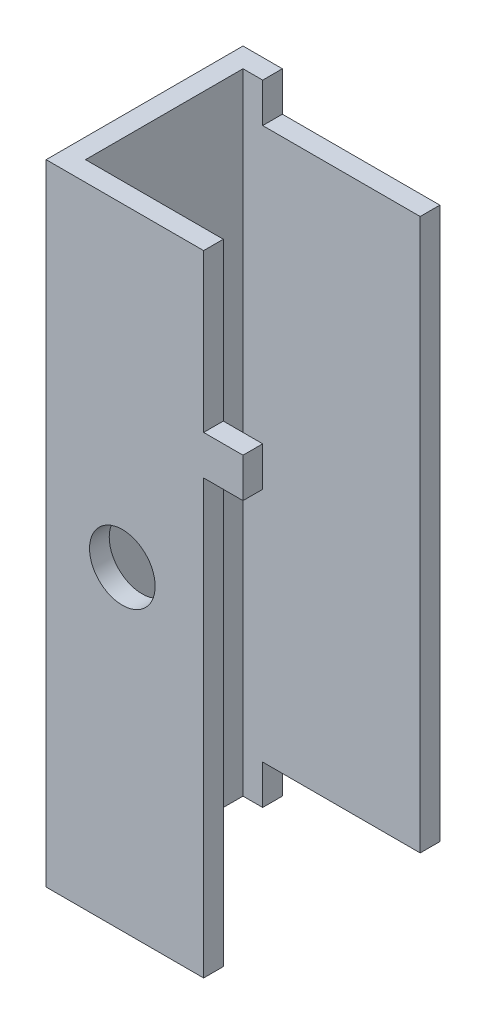
ISO-10303-21;
HEADER;
FILE_DESCRIPTION(('STEP AP214'),'2;1');
FILE_NAME('part.step','',(''),(''),'','','');
FILE_SCHEMA(('AUTOMOTIVE_DESIGN { 1 0 10303 214 1 1 1 1 }'));
ENDSEC;
DATA;
#1=APPLICATION_CONTEXT('core data for automotive mechanical design processes');
#2=APPLICATION_PROTOCOL_DEFINITION('international standard','automotive_design',2000,#1);
#3=PRODUCT_CONTEXT('',#1,'mechanical');
#4=PRODUCT('Part','Part','',(#3));
#5=PRODUCT_RELATED_PRODUCT_CATEGORY('part','',(#4));
#6=PRODUCT_DEFINITION_FORMATION('','',#4);
#7=PRODUCT_DEFINITION_CONTEXT('part definition',#1,'design');
#8=PRODUCT_DEFINITION('design','',#6,#7);
#9=PRODUCT_DEFINITION_SHAPE('','',#8);
#10=(LENGTH_UNIT() NAMED_UNIT(*) SI_UNIT(.MILLI.,.METRE.));
#11=(NAMED_UNIT(*) PLANE_ANGLE_UNIT() SI_UNIT($,.RADIAN.));
#12=(NAMED_UNIT(*) SI_UNIT($,.STERADIAN.) SOLID_ANGLE_UNIT());
#13=UNCERTAINTY_MEASURE_WITH_UNIT(LENGTH_MEASURE(1.E-05),#10,'distance_accuracy_value','');
#14=(GEOMETRIC_REPRESENTATION_CONTEXT(3) GLOBAL_UNCERTAINTY_ASSIGNED_CONTEXT((#13)) GLOBAL_UNIT_ASSIGNED_CONTEXT((#10,
#11,#12)) REPRESENTATION_CONTEXT('',''));
#15=CARTESIAN_POINT('',(0.,0.,0.));
#16=DIRECTION('',(0.,0.,1.));
#17=DIRECTION('',(1.,0.,0.));
#18=AXIS2_PLACEMENT_3D('',#15,#16,#17);
#19=CARTESIAN_POINT('',(-1.6,0.8,0.));
#20=DIRECTION('',(-1.,0.,0.));
#21=DIRECTION('',(0.,0.,1.));
#22=AXIS2_PLACEMENT_3D('',#19,#20,#21);
#23=PLANE('',#22);
#24=DIRECTION('',(0.,-1.,0.));
#25=VECTOR('',#24,1.);
#26=CARTESIAN_POINT('',(-1.60000000001,0.80000000001,0.));
#27=LINE('',#26,#25);
#28=CARTESIAN_POINT('',(-1.6,0.8,0.));
#29=VERTEX_POINT('',#28);
#30=CARTESIAN_POINT('',(-1.6,-0.8,0.));
#31=VERTEX_POINT('',#30);
#32=EDGE_CURVE('E271',#29,#31,#27,.T.);
#33=ORIENTED_EDGE('',*,*,#32,.T.);
#34=DIRECTION('',(0.,0.,1.));
#35=VECTOR('',#34,1.);
#36=CARTESIAN_POINT('',(-1.60000000001,-0.80000000001,0.));
#37=LINE('',#36,#35);
#38=CARTESIAN_POINT('',(-1.6,-0.8,0.5));
#39=VERTEX_POINT('',#38);
#40=EDGE_CURVE('E26',#31,#39,#37,.T.);
#41=ORIENTED_EDGE('',*,*,#40,.T.);
#42=DIRECTION('',(0.,-1.,0.));
#43=VECTOR('',#42,1.);
#44=CARTESIAN_POINT('',(-1.60000000001,0.80000000001,0.50000000001));
#45=LINE('',#44,#43);
#46=CARTESIAN_POINT('',(-1.6,0.8,0.5));
#47=VERTEX_POINT('',#46);
#48=EDGE_CURVE('E286',#47,#39,#45,.T.);
#49=ORIENTED_EDGE('',*,*,#48,.F.);
#50=DIRECTION('',(0.,0.,1.));
#51=VECTOR('',#50,1.);
#52=CARTESIAN_POINT('',(-1.60000000001,0.80000000001,0.));
#53=LINE('',#52,#51);
#54=EDGE_CURVE('E11',#29,#47,#53,.T.);
#55=ORIENTED_EDGE('',*,*,#54,.F.);
#56=EDGE_LOOP('',(#33,#41,#49,#55));
#57=FACE_BOUND('',#56,.T.);
#58=ADVANCED_FACE('F17',(#57),#23,.T.);
#59=CARTESIAN_POINT('',(1.6,0.8,0.));
#60=DIRECTION('',(0.,1.,0.));
#61=DIRECTION('',(1.,0.,0.));
#62=AXIS2_PLACEMENT_3D('',#59,#60,#61);
#63=PLANE('',#62);
#64=DIRECTION('',(0.,0.,-1.));
#65=VECTOR('',#64,1.);
#66=CARTESIAN_POINT('',(-1.50000000001,0.80000000001,0.));
#67=LINE('',#66,#65);
#68=CARTESIAN_POINT('',(-1.5,0.8,0.05));
#69=VERTEX_POINT('',#68);
#70=CARTESIAN_POINT('',(-1.5,0.8,0.));
#71=VERTEX_POINT('',#70);
#72=EDGE_CURVE('E213',#69,#71,#67,.T.);
#73=ORIENTED_EDGE('',*,*,#72,.T.);
#74=DIRECTION('',(-1.,0.,0.));
#75=VECTOR('',#74,1.);
#76=CARTESIAN_POINT('',(1.60000000001,0.80000000001,0.));
#77=LINE('',#76,#75);
#78=EDGE_CURVE('E273',#71,#29,#77,.T.);
#79=ORIENTED_EDGE('',*,*,#78,.T.);
#80=ORIENTED_EDGE('',*,*,#54,.T.);
#81=DIRECTION('',(-1.,0.,0.));
#82=VECTOR('',#81,1.);
#83=CARTESIAN_POINT('',(1.60000000001,0.80000000001,0.50000000001));
#84=LINE('',#83,#82);
#85=CARTESIAN_POINT('',(-1.2,0.8,0.5));
#86=VERTEX_POINT('',#85);
#87=EDGE_CURVE('E291',#86,#47,#84,.T.);
#88=ORIENTED_EDGE('',*,*,#87,.F.);
#89=DIRECTION('',(0.,0.,-1.));
#90=VECTOR('',#89,1.);
#91=CARTESIAN_POINT('',(-1.20000000001,0.80000000001,0.25000000001));
#92=LINE('',#91,#90);
#93=CARTESIAN_POINT('',(-1.2,0.8,0.45));
#94=VERTEX_POINT('',#93);
#95=EDGE_CURVE('E258',#86,#94,#92,.T.);
#96=ORIENTED_EDGE('',*,*,#95,.T.);
#97=DIRECTION('',(-1.,0.,0.));
#98=VECTOR('',#97,1.);
#99=CARTESIAN_POINT('',(1.57500000001,0.80000000001,0.45000000001));
#100=LINE('',#99,#98);
#101=CARTESIAN_POINT('',(-1.55,0.8,0.45));
#102=VERTEX_POINT('',#101);
#103=EDGE_CURVE('E262',#94,#102,#100,.T.);
#104=ORIENTED_EDGE('',*,*,#103,.T.);
#105=DIRECTION('',(0.,0.,-1.));
#106=VECTOR('',#105,1.);
#107=CARTESIAN_POINT('',(-1.55000000001,0.80000000001,0.22500000001));
#108=LINE('',#107,#106);
#109=CARTESIAN_POINT('',(-1.55,0.8,0.05));
#110=VERTEX_POINT('',#109);
#111=EDGE_CURVE('E363',#102,#110,#108,.T.);
#112=ORIENTED_EDGE('',*,*,#111,.T.);
#113=DIRECTION('',(1.,0.,0.));
#114=VECTOR('',#113,1.);
#115=CARTESIAN_POINT('',(0.02500000001,0.80000000001,0.05000000001));
#116=LINE('',#115,#114);
#117=EDGE_CURVE('E304',#110,#69,#116,.T.);
#118=ORIENTED_EDGE('',*,*,#117,.T.);
#119=EDGE_LOOP('',(#73,#79,#80,#88,#96,#104,#112,#118));
#120=FACE_BOUND('',#119,.T.);
#121=ADVANCED_FACE('F396',(#120),#63,.T.);
#122=CARTESIAN_POINT('',(-1.2,0.3,0.5));
#123=DIRECTION('',(0.,1.,0.));
#124=DIRECTION('',(1.,0.,0.));
#125=AXIS2_PLACEMENT_3D('',#122,#123,#124);
#126=PLANE('',#125);
#127=DIRECTION('',(-1.,0.,0.));
#128=VECTOR('',#127,1.);
#129=CARTESIAN_POINT('',(0.17500000001,0.30000000001,0.45000000001));
#130=LINE('',#129,#128);
#131=CARTESIAN_POINT('',(-1.1,0.3,0.45));
#132=VERTEX_POINT('',#131);
#133=CARTESIAN_POINT('',(-1.2,0.3,0.45));
#134=VERTEX_POINT('',#133);
#135=EDGE_CURVE('E341',#132,#134,#130,.T.);
#136=ORIENTED_EDGE('',*,*,#135,.F.);
#137=DIRECTION('',(0.,0.,-1.));
#138=VECTOR('',#137,1.);
#139=CARTESIAN_POINT('',(-1.10000000001,0.30000000001,0.50000000001));
#140=LINE('',#139,#138);
#141=CARTESIAN_POINT('',(-1.1,0.3,0.5));
#142=VERTEX_POINT('',#141);
#143=EDGE_CURVE('E376',#142,#132,#140,.T.);
#144=ORIENTED_EDGE('',*,*,#143,.F.);
#145=DIRECTION('',(1.,0.,0.));
#146=VECTOR('',#145,1.);
#147=CARTESIAN_POINT('',(-0.60000000001,0.30000000001,0.50000000001));
#148=LINE('',#147,#146);
#149=CARTESIAN_POINT('',(-1.2,0.3,0.5));
#150=VERTEX_POINT('',#149);
#151=EDGE_CURVE('E359',#150,#142,#148,.T.);
#152=ORIENTED_EDGE('',*,*,#151,.F.);
#153=DIRECTION('',(0.,0.,-1.));
#154=VECTOR('',#153,1.);
#155=CARTESIAN_POINT('',(-1.20000000001,0.30000000001,0.50000000001));
#156=LINE('',#155,#154);
#157=EDGE_CURVE('E241',#150,#134,#156,.T.);
#158=ORIENTED_EDGE('',*,*,#157,.T.);
#159=EDGE_LOOP('',(#136,#144,#152,#158));
#160=FACE_BOUND('',#159,.T.);
#161=ADVANCED_FACE('F422',(#160),#126,.F.);
#162=CARTESIAN_POINT('',(-1.1,-0.7,0.));
#163=DIRECTION('',(0.,1.,0.));
#164=DIRECTION('',(1.,0.,0.));
#165=AXIS2_PLACEMENT_3D('',#162,#163,#164);
#166=PLANE('',#165);
#167=DIRECTION('',(1.,0.,0.));
#168=VECTOR('',#167,1.);
#169=CARTESIAN_POINT('',(-1.32500000001,-0.70000000001,0.05000000001));
#170=LINE('',#169,#168);
#171=CARTESIAN_POINT('',(-1.5,-0.7,0.05));
#172=VERTEX_POINT('',#171);
#173=CARTESIAN_POINT('',(-1.1,-0.7,0.05));
#174=VERTEX_POINT('',#173);
#175=EDGE_CURVE('E315',#172,#174,#170,.T.);
#176=ORIENTED_EDGE('',*,*,#175,.F.);
#177=DIRECTION('',(0.,0.,1.));
#178=VECTOR('',#177,1.);
#179=CARTESIAN_POINT('',(-1.50000000001,-0.70000000001,0.));
#180=LINE('',#179,#178);
#181=CARTESIAN_POINT('',(-1.5,-0.7,0.));
#182=VERTEX_POINT('',#181);
#183=EDGE_CURVE('E197',#182,#172,#180,.T.);
#184=ORIENTED_EDGE('',*,*,#183,.F.);
#185=DIRECTION('',(-1.,0.,0.));
#186=VECTOR('',#185,1.);
#187=CARTESIAN_POINT('',(-0.55000000001,-0.70000000001,0.));
#188=LINE('',#187,#186);
#189=CARTESIAN_POINT('',(-1.1,-0.7,0.));
#190=VERTEX_POINT('',#189);
#191=EDGE_CURVE('E249',#190,#182,#188,.T.);
#192=ORIENTED_EDGE('',*,*,#191,.F.);
#193=DIRECTION('',(0.,0.,-1.));
#194=VECTOR('',#193,1.);
#195=CARTESIAN_POINT('',(-1.10000000001,-0.70000000001,0.25000000001));
#196=LINE('',#195,#194);
#197=EDGE_CURVE('E20',#174,#190,#196,.T.);
#198=ORIENTED_EDGE('',*,*,#197,.F.);
#199=EDGE_LOOP('',(#176,#184,#192,#198));
#200=FACE_BOUND('',#199,.T.);
#201=ADVANCED_FACE('F390',(#200),#166,.F.);
#202=CARTESIAN_POINT('',(-1.6,-0.8,0.));
#203=DIRECTION('',(0.,-1.,0.));
#204=DIRECTION('',(0.,0.,-1.));
#205=AXIS2_PLACEMENT_3D('',#202,#203,#204);
#206=PLANE('',#205);
#207=DIRECTION('',(0.,0.,1.));
#208=VECTOR('',#207,1.);
#209=CARTESIAN_POINT('',(-1.50000000001,-0.80000000001,0.));
#210=LINE('',#209,#208);
#211=CARTESIAN_POINT('',(-1.5,-0.8,0.));
#212=VERTEX_POINT('',#211);
#213=CARTESIAN_POINT('',(-1.5,-0.8,0.05));
#214=VERTEX_POINT('',#213);
#215=EDGE_CURVE('E245',#212,#214,#210,.T.);
#216=ORIENTED_EDGE('',*,*,#215,.T.);
#217=DIRECTION('',(-1.,0.,0.));
#218=VECTOR('',#217,1.);
#219=CARTESIAN_POINT('',(-1.57500000001,-0.80000000001,0.05000000001));
#220=LINE('',#219,#218);
#221=CARTESIAN_POINT('',(-1.55,-0.8,0.05));
#222=VERTEX_POINT('',#221);
#223=EDGE_CURVE('E311',#214,#222,#220,.T.);
#224=ORIENTED_EDGE('',*,*,#223,.T.);
#225=DIRECTION('',(0.,0.,1.));
#226=VECTOR('',#225,1.);
#227=CARTESIAN_POINT('',(-1.55000000001,-0.80000000001,0.22500000001));
#228=LINE('',#227,#226);
#229=CARTESIAN_POINT('',(-1.55,-0.8,0.45));
#230=VERTEX_POINT('',#229);
#231=EDGE_CURVE('E360',#222,#230,#228,.T.);
#232=ORIENTED_EDGE('',*,*,#231,.T.);
#233=DIRECTION('',(1.,0.,0.));
#234=VECTOR('',#233,1.);
#235=CARTESIAN_POINT('',(-0.02500000001,-0.80000000001,0.45000000001));
#236=LINE('',#235,#234);
#237=CARTESIAN_POINT('',(-1.2,-0.8,0.45));
#238=VERTEX_POINT('',#237);
#239=EDGE_CURVE('E296',#230,#238,#236,.T.);
#240=ORIENTED_EDGE('',*,*,#239,.T.);
#241=DIRECTION('',(0.,0.,1.));
#242=VECTOR('',#241,1.);
#243=CARTESIAN_POINT('',(-1.20000000001,-0.80000000001,0.25000000001));
#244=LINE('',#243,#242);
#245=CARTESIAN_POINT('',(-1.2,-0.8,0.5));
#246=VERTEX_POINT('',#245);
#247=EDGE_CURVE('E240',#238,#246,#244,.T.);
#248=ORIENTED_EDGE('',*,*,#247,.T.);
#249=DIRECTION('',(1.,0.,0.));
#250=VECTOR('',#249,1.);
#251=CARTESIAN_POINT('',(-1.60000000001,-0.80000000001,0.50000000001));
#252=LINE('',#251,#250);
#253=EDGE_CURVE('E290',#39,#246,#252,.T.);
#254=ORIENTED_EDGE('',*,*,#253,.F.);
#255=ORIENTED_EDGE('',*,*,#40,.F.);
#256=DIRECTION('',(1.,0.,0.));
#257=VECTOR('',#256,1.);
#258=CARTESIAN_POINT('',(-1.60000000001,-0.80000000001,0.));
#259=LINE('',#258,#257);
#260=EDGE_CURVE('E252',#31,#212,#259,.T.);
#261=ORIENTED_EDGE('',*,*,#260,.T.);
#262=EDGE_LOOP('',(#216,#224,#232,#240,#248,#254,#255,#261));
#263=FACE_BOUND('',#262,.T.);
#264=ADVANCED_FACE('F403',(#263),#206,.T.);
#265=CARTESIAN_POINT('',(-1.1,-0.8,0.5));
#266=DIRECTION('',(-1.,0.,0.));
#267=DIRECTION('',(0.,0.,1.));
#268=AXIS2_PLACEMENT_3D('',#265,#266,#267);
#269=PLANE('',#268);
#270=DIRECTION('',(0.,0.,1.));
#271=VECTOR('',#270,1.);
#272=CARTESIAN_POINT('',(-1.10000000001,0.70000000001,0.25000000001));
#273=LINE('',#272,#271);
#274=CARTESIAN_POINT('',(-1.1,0.7,0.));
#275=VERTEX_POINT('',#274);
#276=CARTESIAN_POINT('',(-1.1,0.7,0.05));
#277=VERTEX_POINT('',#276);
#278=EDGE_CURVE('E196',#275,#277,#273,.T.);
#279=ORIENTED_EDGE('',*,*,#278,.T.);
#280=DIRECTION('',(0.,-1.,0.));
#281=VECTOR('',#280,1.);
#282=CARTESIAN_POINT('',(-1.10000000001,-0.80000000001,0.05000000001));
#283=LINE('',#282,#281);
#284=EDGE_CURVE('E191',#277,#174,#283,.T.);
#285=ORIENTED_EDGE('',*,*,#284,.T.);
#286=ORIENTED_EDGE('',*,*,#197,.T.);
#287=DIRECTION('',(0.,-1.,0.));
#288=VECTOR('',#287,1.);
#289=CARTESIAN_POINT('',(-1.10000000001,-0.40000000001,0.));
#290=LINE('',#289,#288);
#291=EDGE_CURVE('E253',#275,#190,#290,.T.);
#292=ORIENTED_EDGE('',*,*,#291,.F.);
#293=EDGE_LOOP('',(#279,#285,#286,#292));
#294=FACE_BOUND('',#293,.T.);
#295=ADVANCED_FACE('F387',(#294),#269,.F.);
#296=CARTESIAN_POINT('',(-1.1,-0.8,0.5));
#297=DIRECTION('',(-1.,0.,0.));
#298=DIRECTION('',(0.,0.,1.));
#299=AXIS2_PLACEMENT_3D('',#296,#297,#298);
#300=PLANE('',#299);
#301=ORIENTED_EDGE('',*,*,#143,.T.);
#302=DIRECTION('',(0.,1.,0.));
#303=VECTOR('',#302,1.);
#304=CARTESIAN_POINT('',(-1.10000000001,-0.80000000001,0.45000000001));
#305=LINE('',#304,#303);
#306=CARTESIAN_POINT('',(-1.1,0.4,0.45));
#307=VERTEX_POINT('',#306);
#308=EDGE_CURVE('E338',#132,#307,#305,.T.);
#309=ORIENTED_EDGE('',*,*,#308,.T.);
#310=DIRECTION('',(0.,0.,1.));
#311=VECTOR('',#310,1.);
#312=CARTESIAN_POINT('',(-1.10000000001,0.40000000001,0.50000000001));
#313=LINE('',#312,#311);
#314=CARTESIAN_POINT('',(-1.1,0.4,0.5));
#315=VERTEX_POINT('',#314);
#316=EDGE_CURVE('E328',#307,#315,#313,.T.);
#317=ORIENTED_EDGE('',*,*,#316,.T.);
#318=DIRECTION('',(0.,1.,0.));
#319=VECTOR('',#318,1.);
#320=CARTESIAN_POINT('',(-1.10000000001,-0.40000000001,0.50000000001));
#321=LINE('',#320,#319);
#322=EDGE_CURVE('E367',#142,#315,#321,.T.);
#323=ORIENTED_EDGE('',*,*,#322,.F.);
#324=EDGE_LOOP('',(#301,#309,#317,#323));
#325=FACE_BOUND('',#324,.T.);
#326=ADVANCED_FACE('F440',(#325),#300,.F.);
#327=CARTESIAN_POINT('',(-1.55,-0.8,0.45));
#328=DIRECTION('',(-1.,0.,0.));
#329=DIRECTION('',(0.,0.,1.));
#330=AXIS2_PLACEMENT_3D('',#327,#328,#329);
#331=PLANE('',#330);
#332=ORIENTED_EDGE('',*,*,#231,.F.);
#333=DIRECTION('',(0.,-1.,0.));
#334=VECTOR('',#333,1.);
#335=CARTESIAN_POINT('',(-1.55000000001,-0.80000000001,0.05000000001));
#336=LINE('',#335,#334);
#337=EDGE_CURVE('E307',#110,#222,#336,.T.);
#338=ORIENTED_EDGE('',*,*,#337,.F.);
#339=ORIENTED_EDGE('',*,*,#111,.F.);
#340=DIRECTION('',(0.,-1.,0.));
#341=VECTOR('',#340,1.);
#342=CARTESIAN_POINT('',(-1.55000000001,-0.80000000001,0.45000000001));
#343=LINE('',#342,#341);
#344=EDGE_CURVE('E292',#102,#230,#343,.T.);
#345=ORIENTED_EDGE('',*,*,#344,.T.);
#346=EDGE_LOOP('',(#332,#338,#339,#345));
#347=FACE_BOUND('',#346,.T.);
#348=ADVANCED_FACE('F399',(#347),#331,.F.);
#349=CARTESIAN_POINT('',(0.,0.,0.5));
#350=DIRECTION('',(0.,0.,1.));
#351=DIRECTION('',(1.,0.,0.));
#352=AXIS2_PLACEMENT_3D('',#349,#350,#351);
#353=PLANE('',#352);
#354=CARTESIAN_POINT('',(-1.406451372786,0.,0.50000000001));
#355=DIRECTION('',(0.,0.,-1.));
#356=DIRECTION('',(-1.,0.,0.));
#357=AXIS2_PLACEMENT_3D('',#354,#355,#356);
#358=CIRCLE('',#357,0.0833178);
#359=CARTESIAN_POINT('',(-1.489769172786,0.,0.50000000001));
#360=VERTEX_POINT('',#359);
#361=CARTESIAN_POINT('',(-1.323133572776,0.,0.50000000001));
#362=VERTEX_POINT('',#361);
#363=EDGE_CURVE('E219',#360,#362,#358,.T.);
#364=ORIENTED_EDGE('',*,*,#363,.T.);
#365=CARTESIAN_POINT('',(-1.406451372786,0.,0.50000000001));
#366=DIRECTION('',(0.,0.,-1.));
#367=DIRECTION('',(-1.,0.,0.));
#368=AXIS2_PLACEMENT_3D('',#365,#366,#367);
#369=CIRCLE('',#368,0.0833178);
#370=EDGE_CURVE('E222',#362,#360,#369,.T.);
#371=ORIENTED_EDGE('',*,*,#370,.T.);
#372=EDGE_LOOP('',(#364,#371));
#373=FACE_BOUND('',#372,.T.);
#374=ORIENTED_EDGE('',*,*,#151,.T.);
#375=ORIENTED_EDGE('',*,*,#322,.T.);
#376=DIRECTION('',(-1.,0.,0.));
#377=VECTOR('',#376,1.);
#378=CARTESIAN_POINT('',(-0.55000000001,0.40000000001,0.50000000001));
#379=LINE('',#378,#377);
#380=CARTESIAN_POINT('',(-1.2,0.4,0.5));
#381=VERTEX_POINT('',#380);
#382=EDGE_CURVE('E327',#315,#381,#379,.T.);
#383=ORIENTED_EDGE('',*,*,#382,.T.);
#384=DIRECTION('',(0.,1.,0.));
#385=VECTOR('',#384,1.);
#386=CARTESIAN_POINT('',(-1.20000000001,0.20000000001,0.50000000001));
#387=LINE('',#386,#385);
#388=EDGE_CURVE('E261',#381,#86,#387,.T.);
#389=ORIENTED_EDGE('',*,*,#388,.T.);
#390=ORIENTED_EDGE('',*,*,#87,.T.);
#391=ORIENTED_EDGE('',*,*,#48,.T.);
#392=ORIENTED_EDGE('',*,*,#253,.T.);
#393=DIRECTION('',(0.,1.,0.));
#394=VECTOR('',#393,1.);
#395=CARTESIAN_POINT('',(-1.20000000001,-0.40000000001,0.50000000001));
#396=LINE('',#395,#394);
#397=EDGE_CURVE('E236',#246,#150,#396,.T.);
#398=ORIENTED_EDGE('',*,*,#397,.T.);
#399=EDGE_LOOP('',(#374,#375,#383,#389,#390,#391,#392,#398));
#400=FACE_BOUND('',#399,.T.);
#401=ADVANCED_FACE('F425',(#373,#400),#353,.T.);
#402=CARTESIAN_POINT('',(-1.2,-0.8,0.5));
#403=DIRECTION('',(-1.,0.,0.));
#404=DIRECTION('',(0.,0.,1.));
#405=AXIS2_PLACEMENT_3D('',#402,#403,#404);
#406=PLANE('',#405);
#407=DIRECTION('',(0.,-1.,0.));
#408=VECTOR('',#407,1.);
#409=CARTESIAN_POINT('',(-1.20000000001,-0.80000000001,0.45000000001));
#410=LINE('',#409,#408);
#411=EDGE_CURVE('E321',#134,#238,#410,.T.);
#412=ORIENTED_EDGE('',*,*,#411,.F.);
#413=ORIENTED_EDGE('',*,*,#157,.F.);
#414=ORIENTED_EDGE('',*,*,#397,.F.);
#415=ORIENTED_EDGE('',*,*,#247,.F.);
#416=EDGE_LOOP('',(#412,#413,#414,#415));
#417=FACE_BOUND('',#416,.T.);
#418=ADVANCED_FACE('F446',(#417),#406,.F.);
#419=CARTESIAN_POINT('',(-1.2,0.4,0.5));
#420=DIRECTION('',(-1.,0.,0.));
#421=DIRECTION('',(0.,0.,1.));
#422=AXIS2_PLACEMENT_3D('',#419,#420,#421);
#423=PLANE('',#422);
#424=DIRECTION('',(0.,-1.,0.));
#425=VECTOR('',#424,1.);
#426=CARTESIAN_POINT('',(-1.20000000001,-0.20000000001,0.45000000001));
#427=LINE('',#426,#425);
#428=CARTESIAN_POINT('',(-1.2,0.4,0.45));
#429=VERTEX_POINT('',#428);
#430=EDGE_CURVE('E332',#94,#429,#427,.T.);
#431=ORIENTED_EDGE('',*,*,#430,.F.);
#432=ORIENTED_EDGE('',*,*,#95,.F.);
#433=ORIENTED_EDGE('',*,*,#388,.F.);
#434=DIRECTION('',(0.,0.,-1.));
#435=VECTOR('',#434,1.);
#436=CARTESIAN_POINT('',(-1.20000000001,0.40000000001,0.50000000001));
#437=LINE('',#436,#435);
#438=EDGE_CURVE('E281',#381,#429,#437,.T.);
#439=ORIENTED_EDGE('',*,*,#438,.T.);
#440=EDGE_LOOP('',(#431,#432,#433,#439));
#441=FACE_BOUND('',#440,.T.);
#442=ADVANCED_FACE('F432',(#441),#423,.F.);
#443=CARTESIAN_POINT('',(1.55,-0.8,0.45));
#444=DIRECTION('',(0.,0.,1.));
#445=DIRECTION('',(1.,0.,0.));
#446=AXIS2_PLACEMENT_3D('',#443,#444,#445);
#447=PLANE('',#446);
#448=CARTESIAN_POINT('',(-1.406451372786,0.,0.45000000001));
#449=DIRECTION('',(0.,0.,1.));
#450=DIRECTION('',(-1.,0.,0.));
#451=AXIS2_PLACEMENT_3D('',#448,#449,#450);
#452=CIRCLE('',#451,0.0833178);
#453=CARTESIAN_POINT('',(-1.489769172786,0.,0.45000000001));
#454=VERTEX_POINT('',#453);
#455=CARTESIAN_POINT('',(-1.323133572776,0.,0.45000000001));
#456=VERTEX_POINT('',#455);
#457=EDGE_CURVE('E228',#454,#456,#452,.T.);
#458=ORIENTED_EDGE('',*,*,#457,.T.);
#459=CARTESIAN_POINT('',(-1.406451372786,0.,0.45000000001));
#460=DIRECTION('',(0.,0.,1.));
#461=DIRECTION('',(-1.,0.,0.));
#462=AXIS2_PLACEMENT_3D('',#459,#460,#461);
#463=CIRCLE('',#462,0.0833178);
#464=EDGE_CURVE('E232',#456,#454,#463,.T.);
#465=ORIENTED_EDGE('',*,*,#464,.T.);
#466=EDGE_LOOP('',(#458,#465));
#467=FACE_BOUND('',#466,.T.);
#468=ORIENTED_EDGE('',*,*,#430,.T.);
#469=DIRECTION('',(1.,0.,0.));
#470=VECTOR('',#469,1.);
#471=CARTESIAN_POINT('',(0.22500000001,0.40000000001,0.45000000001));
#472=LINE('',#471,#470);
#473=EDGE_CURVE('E277',#429,#307,#472,.T.);
#474=ORIENTED_EDGE('',*,*,#473,.T.);
#475=ORIENTED_EDGE('',*,*,#308,.F.);
#476=ORIENTED_EDGE('',*,*,#135,.T.);
#477=ORIENTED_EDGE('',*,*,#411,.T.);
#478=ORIENTED_EDGE('',*,*,#239,.F.);
#479=ORIENTED_EDGE('',*,*,#344,.F.);
#480=ORIENTED_EDGE('',*,*,#103,.F.);
#481=EDGE_LOOP('',(#468,#474,#475,#476,#477,#478,#479,#480));
#482=FACE_BOUND('',#481,.T.);
#483=ADVANCED_FACE('F431',(#467,#482),#447,.F.);
#484=CARTESIAN_POINT('',(-1.1,0.4,0.5));
#485=DIRECTION('',(0.,-1.,0.));
#486=DIRECTION('',(0.,0.,-1.));
#487=AXIS2_PLACEMENT_3D('',#484,#485,#486);
#488=PLANE('',#487);
#489=ORIENTED_EDGE('',*,*,#473,.F.);
#490=ORIENTED_EDGE('',*,*,#438,.F.);
#491=ORIENTED_EDGE('',*,*,#382,.F.);
#492=ORIENTED_EDGE('',*,*,#316,.F.);
#493=EDGE_LOOP('',(#489,#490,#491,#492));
#494=FACE_BOUND('',#493,.T.);
#495=ADVANCED_FACE('F438',(#494),#488,.F.);
#496=CARTESIAN_POINT('',(-1.55,-0.8,0.05));
#497=DIRECTION('',(0.,0.,-1.));
#498=DIRECTION('',(0.,-1.,0.));
#499=AXIS2_PLACEMENT_3D('',#496,#497,#498);
#500=PLANE('',#499);
#501=DIRECTION('',(-1.,0.,0.));
#502=VECTOR('',#501,1.);
#503=CARTESIAN_POINT('',(-1.52500000001,0.70000000001,0.05000000001));
#504=LINE('',#503,#502);
#505=CARTESIAN_POINT('',(-1.5,0.7,0.05));
#506=VERTEX_POINT('',#505);
#507=EDGE_CURVE('E183',#277,#506,#504,.T.);
#508=ORIENTED_EDGE('',*,*,#507,.T.);
#509=DIRECTION('',(0.,1.,0.));
#510=VECTOR('',#509,1.);
#511=CARTESIAN_POINT('',(-1.50000000001,-1.000006938894E-11,0.05000000001));
#512=LINE('',#511,#510);
#513=EDGE_CURVE('E188',#506,#69,#512,.T.);
#514=ORIENTED_EDGE('',*,*,#513,.T.);
#515=ORIENTED_EDGE('',*,*,#117,.F.);
#516=ORIENTED_EDGE('',*,*,#337,.T.);
#517=ORIENTED_EDGE('',*,*,#223,.F.);
#518=DIRECTION('',(0.,1.,0.));
#519=VECTOR('',#518,1.);
#520=CARTESIAN_POINT('',(-1.50000000001,-0.75000000001,0.05000000001));
#521=LINE('',#520,#519);
#522=EDGE_CURVE('E235',#214,#172,#521,.T.);
#523=ORIENTED_EDGE('',*,*,#522,.T.);
#524=ORIENTED_EDGE('',*,*,#175,.T.);
#525=ORIENTED_EDGE('',*,*,#284,.F.);
#526=EDGE_LOOP('',(#508,#514,#515,#516,#517,#523,#524,#525));
#527=FACE_BOUND('',#526,.T.);
#528=ADVANCED_FACE('F185',(#527),#500,.F.);
#529=CARTESIAN_POINT('',(0.,0.,0.));
#530=DIRECTION('',(0.,0.,1.));
#531=DIRECTION('',(1.,0.,0.));
#532=AXIS2_PLACEMENT_3D('',#529,#530,#531);
#533=PLANE('',#532);
#534=DIRECTION('',(1.,0.,0.));
#535=VECTOR('',#534,1.);
#536=CARTESIAN_POINT('',(-0.75000000001,0.70000000001,0.));
#537=LINE('',#536,#535);
#538=CARTESIAN_POINT('',(-1.5,0.7,0.));
#539=VERTEX_POINT('',#538);
#540=EDGE_CURVE('E203',#539,#275,#537,.T.);
#541=ORIENTED_EDGE('',*,*,#540,.T.);
#542=ORIENTED_EDGE('',*,*,#291,.T.);
#543=ORIENTED_EDGE('',*,*,#191,.T.);
#544=DIRECTION('',(0.,-1.,0.));
#545=VECTOR('',#544,1.);
#546=CARTESIAN_POINT('',(-1.50000000001,-0.35000000001,0.));
#547=LINE('',#546,#545);
#548=EDGE_CURVE('E257',#182,#212,#547,.T.);
#549=ORIENTED_EDGE('',*,*,#548,.T.);
#550=ORIENTED_EDGE('',*,*,#260,.F.);
#551=ORIENTED_EDGE('',*,*,#32,.F.);
#552=ORIENTED_EDGE('',*,*,#78,.F.);
#553=DIRECTION('',(0.,-1.,0.));
#554=VECTOR('',#553,1.);
#555=CARTESIAN_POINT('',(-1.50000000001,0.40000000001,0.));
#556=LINE('',#555,#554);
#557=EDGE_CURVE('E208',#71,#539,#556,.T.);
#558=ORIENTED_EDGE('',*,*,#557,.T.);
#559=EDGE_LOOP('',(#541,#542,#543,#549,#550,#551,#552,#558));
#560=FACE_BOUND('',#559,.T.);
#561=ADVANCED_FACE('F393',(#560),#533,.F.);
#562=CARTESIAN_POINT('',(-1.406451372776,0.,0.5));
#563=DIRECTION('',(0.,0.,1.));
#564=DIRECTION('',(-1.,0.,0.));
#565=AXIS2_PLACEMENT_3D('',#562,#563,#564);
#566=CYLINDRICAL_SURFACE('',#565,0.0833178);
#567=ORIENTED_EDGE('',*,*,#457,.F.);
#568=ORIENTED_EDGE('',*,*,#464,.F.);
#569=DIRECTION('',(0.,0.,1.));
#570=VECTOR('',#569,1.);
#571=CARTESIAN_POINT('',(-1.323133572776,0.,0.5));
#572=LINE('',#571,#570);
#573=EDGE_CURVE('E223',#456,#362,#572,.T.);
#574=ORIENTED_EDGE('',*,*,#573,.T.);
#575=ORIENTED_EDGE('',*,*,#363,.F.);
#576=ORIENTED_EDGE('',*,*,#370,.F.);
#577=ORIENTED_EDGE('',*,*,#573,.F.);
#578=EDGE_LOOP('',(#567,#568,#574,#575,#576,#577));
#579=FACE_BOUND('',#578,.T.);
#580=ADVANCED_FACE('F416',(#579),#566,.F.);
#581=CARTESIAN_POINT('',(-1.5,0.7,0.));
#582=DIRECTION('',(0.,-1.,0.));
#583=DIRECTION('',(0.,0.,-1.));
#584=AXIS2_PLACEMENT_3D('',#581,#582,#583);
#585=PLANE('',#584);
#586=ORIENTED_EDGE('',*,*,#507,.F.);
#587=ORIENTED_EDGE('',*,*,#278,.F.);
#588=ORIENTED_EDGE('',*,*,#540,.F.);
#589=DIRECTION('',(0.,0.,1.));
#590=VECTOR('',#589,1.);
#591=CARTESIAN_POINT('',(-1.50000000001,0.70000000001,0.));
#592=LINE('',#591,#590);
#593=EDGE_CURVE('E200',#539,#506,#592,.T.);
#594=ORIENTED_EDGE('',*,*,#593,.T.);
#595=EDGE_LOOP('',(#586,#587,#588,#594));
#596=FACE_BOUND('',#595,.T.);
#597=ADVANCED_FACE('F201',(#596),#585,.F.);
#598=CARTESIAN_POINT('',(-1.5,-0.7,0.));
#599=DIRECTION('',(-1.,0.,0.));
#600=DIRECTION('',(0.,0.,1.));
#601=AXIS2_PLACEMENT_3D('',#598,#599,#600);
#602=PLANE('',#601);
#603=ORIENTED_EDGE('',*,*,#522,.F.);
#604=ORIENTED_EDGE('',*,*,#215,.F.);
#605=ORIENTED_EDGE('',*,*,#548,.F.);
#606=ORIENTED_EDGE('',*,*,#183,.T.);
#607=EDGE_LOOP('',(#603,#604,#605,#606));
#608=FACE_BOUND('',#607,.T.);
#609=ADVANCED_FACE('F407',(#608),#602,.F.);
#610=CARTESIAN_POINT('',(-1.5,0.8,0.));
#611=DIRECTION('',(-1.,0.,0.));
#612=DIRECTION('',(0.,0.,1.));
#613=AXIS2_PLACEMENT_3D('',#610,#611,#612);
#614=PLANE('',#613);
#615=ORIENTED_EDGE('',*,*,#513,.F.);
#616=ORIENTED_EDGE('',*,*,#593,.F.);
#617=ORIENTED_EDGE('',*,*,#557,.F.);
#618=ORIENTED_EDGE('',*,*,#72,.F.);
#619=EDGE_LOOP('',(#615,#616,#617,#618));
#620=FACE_BOUND('',#619,.T.);
#621=ADVANCED_FACE('F211',(#620),#614,.F.);
#622=CLOSED_SHELL('',(#58,#121,#161,#201,#264,#295,#326,#348,#401,#418,#442,#483,#495,#528,#561,
#580,#597,#609,#621));
#623=MANIFOLD_SOLID_BREP('B1',#622);
#624=ADVANCED_BREP_SHAPE_REPRESENTATION('',(#18,#623),#14);
#625=SHAPE_DEFINITION_REPRESENTATION(#9,#624);
ENDSEC;
END-ISO-10303-21;
